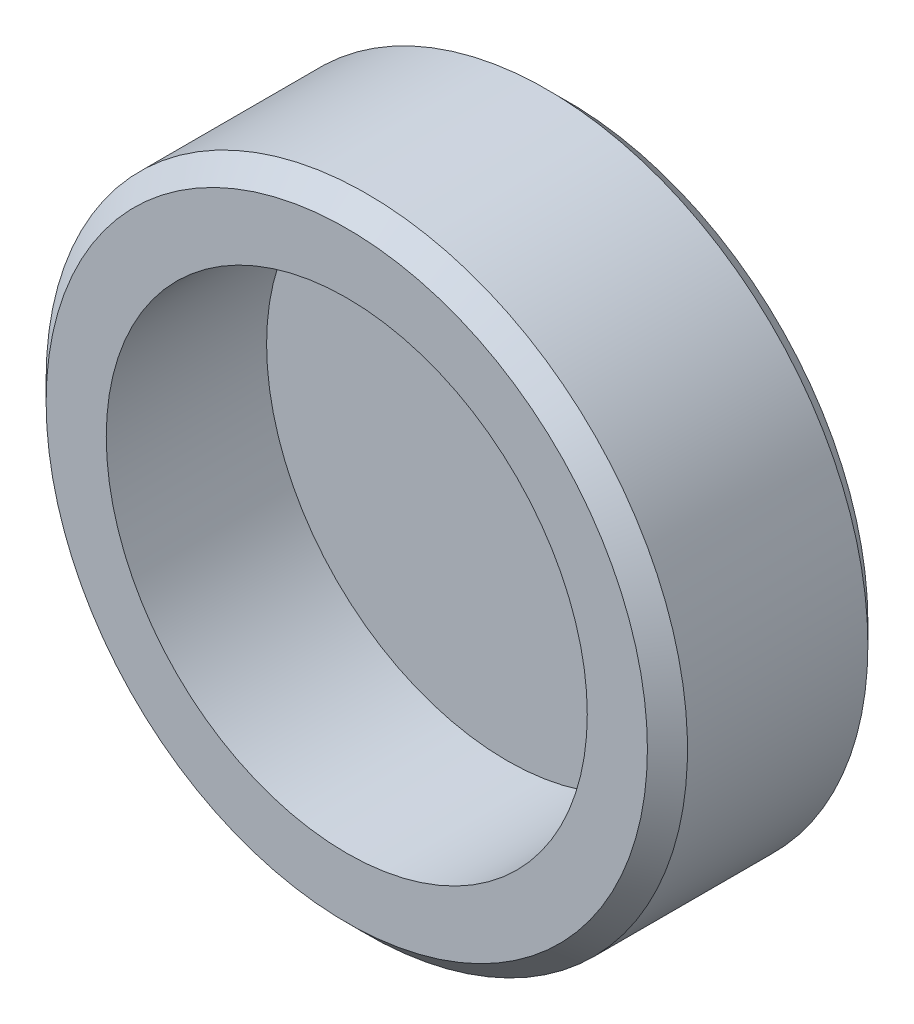
ISO-10303-21;
HEADER;
FILE_DESCRIPTION(('STEP AP214'),'2;1');
FILE_NAME('part.step','',(''),(''),'','','');
FILE_SCHEMA(('AUTOMOTIVE_DESIGN { 1 0 10303 214 1 1 1 1 }'));
ENDSEC;
DATA;
#1=APPLICATION_CONTEXT('core data for automotive mechanical design processes');
#2=APPLICATION_PROTOCOL_DEFINITION('international standard','automotive_design',2000,#1);
#3=PRODUCT_CONTEXT('',#1,'mechanical');
#4=PRODUCT('Part','Part','',(#3));
#5=PRODUCT_RELATED_PRODUCT_CATEGORY('part','',(#4));
#6=PRODUCT_DEFINITION_FORMATION('','',#4);
#7=PRODUCT_DEFINITION_CONTEXT('part definition',#1,'design');
#8=PRODUCT_DEFINITION('design','',#6,#7);
#9=PRODUCT_DEFINITION_SHAPE('','',#8);
#10=(LENGTH_UNIT() NAMED_UNIT(*) SI_UNIT(.MILLI.,.METRE.));
#11=(NAMED_UNIT(*) PLANE_ANGLE_UNIT() SI_UNIT($,.RADIAN.));
#12=(NAMED_UNIT(*) SI_UNIT($,.STERADIAN.) SOLID_ANGLE_UNIT());
#13=UNCERTAINTY_MEASURE_WITH_UNIT(LENGTH_MEASURE(1.E-05),#10,'distance_accuracy_value','');
#14=(GEOMETRIC_REPRESENTATION_CONTEXT(3) GLOBAL_UNCERTAINTY_ASSIGNED_CONTEXT((#13)) GLOBAL_UNIT_ASSIGNED_CONTEXT((#10,
#11,#12)) REPRESENTATION_CONTEXT('',''));
#15=CARTESIAN_POINT('',(0.,0.,0.));
#16=DIRECTION('',(0.,0.,1.));
#17=DIRECTION('',(1.,0.,0.));
#18=AXIS2_PLACEMENT_3D('',#15,#16,#17);
#19=CARTESIAN_POINT('',(0.,0.,11.));
#20=DIRECTION('',(0.,0.,-1.));
#21=DIRECTION('',(-1.,0.,0.));
#22=AXIS2_PLACEMENT_3D('',#19,#20,#21);
#23=CYLINDRICAL_SURFACE('',#22,16.);
#24=CARTESIAN_POINT('',(0.,0.,1.));
#25=DIRECTION('',(0.,0.,1.));
#26=DIRECTION('',(1.,0.,0.));
#27=AXIS2_PLACEMENT_3D('',#24,#25,#26);
#28=CIRCLE('',#27,16.);
#29=CARTESIAN_POINT('',(-16.,0.,0.999999999999999));
#30=VERTEX_POINT('',#29);
#31=EDGE_CURVE('E40',#30,#30,#28,.T.);
#32=CARTESIAN_POINT('',(0.,0.,9.99999999999998));
#33=DIRECTION('',(0.,0.,1.));
#34=DIRECTION('',(1.,0.,0.));
#35=AXIS2_PLACEMENT_3D('',#32,#33,#34);
#36=CIRCLE('',#35,16.);
#37=CARTESIAN_POINT('',(-16.,0.,9.99999999999998));
#38=VERTEX_POINT('',#37);
#39=EDGE_CURVE('E44',#38,#38,#36,.F.);
#40=CARTESIAN_POINT('',(-16.,0.,0.999999999999999));
#41=CARTESIAN_POINT('',(-16.,0.,1.09375));
#42=CARTESIAN_POINT('',(-16.,0.,1.1875));
#43=CARTESIAN_POINT('',(-16.,0.,1.375));
#44=CARTESIAN_POINT('',(-16.,0.,1.46875));
#45=CARTESIAN_POINT('',(-16.,0.,1.65625));
#46=CARTESIAN_POINT('',(-16.,0.,1.75));
#47=CARTESIAN_POINT('',(-16.,0.,1.9375));
#48=CARTESIAN_POINT('',(-16.,0.,2.03125));
#49=CARTESIAN_POINT('',(-16.,0.,2.21875));
#50=CARTESIAN_POINT('',(-16.,0.,2.3125));
#51=CARTESIAN_POINT('',(-16.,0.,2.5));
#52=CARTESIAN_POINT('',(-16.,0.,2.59375));
#53=CARTESIAN_POINT('',(-16.,0.,2.78125));
#54=CARTESIAN_POINT('',(-16.,0.,2.875));
#55=CARTESIAN_POINT('',(-16.,0.,3.0625));
#56=CARTESIAN_POINT('',(-16.,0.,3.15624999999999));
#57=CARTESIAN_POINT('',(-16.,0.,3.34374999999999));
#58=CARTESIAN_POINT('',(-16.,0.,3.43749999999999));
#59=CARTESIAN_POINT('',(-16.,0.,3.62499999999999));
#60=CARTESIAN_POINT('',(-16.,0.,3.71874999999999));
#61=CARTESIAN_POINT('',(-16.,0.,3.90624999999999));
#62=CARTESIAN_POINT('',(-16.,0.,3.99999999999999));
#63=CARTESIAN_POINT('',(-16.,0.,4.18749999999999));
#64=CARTESIAN_POINT('',(-16.,0.,4.28124999999999));
#65=CARTESIAN_POINT('',(-16.,0.,4.46874999999999));
#66=CARTESIAN_POINT('',(-16.,0.,4.56249999999999));
#67=CARTESIAN_POINT('',(-16.,0.,4.74999999999999));
#68=CARTESIAN_POINT('',(-16.,0.,4.84374999999999));
#69=CARTESIAN_POINT('',(-16.,0.,5.03124999999999));
#70=CARTESIAN_POINT('',(-16.,0.,5.12499999999999));
#71=CARTESIAN_POINT('',(-16.,0.,5.31249999999999));
#72=CARTESIAN_POINT('',(-16.,0.,5.40624999999999));
#73=CARTESIAN_POINT('',(-16.,0.,5.59374999999999));
#74=CARTESIAN_POINT('',(-16.,0.,5.68749999999999));
#75=CARTESIAN_POINT('',(-16.,0.,5.87499999999999));
#76=CARTESIAN_POINT('',(-16.,0.,5.96874999999999));
#77=CARTESIAN_POINT('',(-16.,0.,6.15624999999999));
#78=CARTESIAN_POINT('',(-16.,0.,6.24999999999999));
#79=CARTESIAN_POINT('',(-16.,0.,6.43749999999999));
#80=CARTESIAN_POINT('',(-16.,0.,6.53124999999999));
#81=CARTESIAN_POINT('',(-16.,0.,6.71874999999999));
#82=CARTESIAN_POINT('',(-16.,0.,6.81249999999999));
#83=CARTESIAN_POINT('',(-16.,0.,6.99999999999999));
#84=CARTESIAN_POINT('',(-16.,0.,7.09374999999999));
#85=CARTESIAN_POINT('',(-16.,0.,7.28124999999999));
#86=CARTESIAN_POINT('',(-16.,0.,7.37499999999999));
#87=CARTESIAN_POINT('',(-16.,0.,7.56249999999999));
#88=CARTESIAN_POINT('',(-16.,0.,7.65624999999999));
#89=CARTESIAN_POINT('',(-16.,0.,7.84374999999999));
#90=CARTESIAN_POINT('',(-16.,0.,7.93749999999999));
#91=CARTESIAN_POINT('',(-16.,0.,8.12499999999999));
#92=CARTESIAN_POINT('',(-16.,0.,8.21874999999999));
#93=CARTESIAN_POINT('',(-16.,0.,8.40624999999999));
#94=CARTESIAN_POINT('',(-16.,0.,8.49999999999999));
#95=CARTESIAN_POINT('',(-16.,0.,8.68749999999999));
#96=CARTESIAN_POINT('',(-16.,0.,8.78124999999998));
#97=CARTESIAN_POINT('',(-16.,0.,8.96874999999998));
#98=CARTESIAN_POINT('',(-16.,0.,9.06249999999998));
#99=CARTESIAN_POINT('',(-16.,0.,9.24999999999998));
#100=CARTESIAN_POINT('',(-16.,0.,9.34374999999998));
#101=CARTESIAN_POINT('',(-16.,0.,9.53124999999998));
#102=CARTESIAN_POINT('',(-16.,0.,9.62499999999998));
#103=CARTESIAN_POINT('',(-16.,0.,9.81249999999998));
#104=CARTESIAN_POINT('',(-16.,0.,9.90624999999998));
#105=CARTESIAN_POINT('',(-16.,0.,9.99999999999998));
#106=B_SPLINE_CURVE_WITH_KNOTS('',3,(#40,#41,#42,#43,#44,#45,#46,#47,#48,#49,#50,#51,#52,#53,
#54,#55,#56,#57,#58,#59,#60,#61,#62,#63,#64,#65,#66,#67,#68,#69,#70,#71,#72,#73,#74,#75,#76,#77,
#78,#79,#80,#81,#82,#83,#84,#85,#86,#87,#88,#89,#90,#91,#92,#93,#94,#95,#96,#97,#98,#99,#100,
#101,#102,#103,#104,#105),.UNSPECIFIED.,.F.,.F.,(4,2,2,2,2,2,2,2,2,2,2,2,2,2,2,2,2,2,2,2,2,2,2,
2,2,2,2,2,2,2,2,2,4),(0.,0.281249999999999,0.562499999999997,0.843749999999997,1.125,1.40625,
1.6875,1.96875,2.25,2.53125,2.81249999999999,3.09374999999999,3.37499999999999,3.65624999999999,
3.93749999999999,4.21874999999999,4.49999999999999,4.78124999999999,5.06249999999999,
5.34374999999999,5.62499999999999,5.90624999999999,6.18749999999999,6.46874999999999,
6.74999999999999,7.03124999999999,7.31249999999999,7.59374999999999,7.87499999999998,
8.15624999999998,8.43749999999999,8.71874999999998,8.99999999999998),.UNSPECIFIED.);
#107=EDGE_CURVE('BSEAM30',#30,#38,#106,.T.);
#108=ORIENTED_EDGE('',*,*,#31,.T.);
#109=ORIENTED_EDGE('',*,*,#39,.T.);
#110=ORIENTED_EDGE('',*,*,#107,.T.);
#111=ORIENTED_EDGE('',*,*,#107,.F.);
#112=EDGE_LOOP('',(#108,#110,#109,#111));
#113=FACE_BOUND('',#112,.T.);
#114=ADVANCED_FACE('F30',(#113),#23,.T.);
#115=CARTESIAN_POINT('',(0.,0.,11.));
#116=DIRECTION('',(0.,0.,1.));
#117=DIRECTION('',(1.,0.,0.));
#118=AXIS2_PLACEMENT_3D('',#115,#116,#117);
#119=PLANE('',#118);
#120=CARTESIAN_POINT('',(0.,0.,11.));
#121=DIRECTION('',(0.,0.,1.));
#122=DIRECTION('',(1.,0.,0.));
#123=AXIS2_PLACEMENT_3D('',#120,#121,#122);
#124=CIRCLE('',#123,12.);
#125=CARTESIAN_POINT('',(12.,0.,11.));
#126=VERTEX_POINT('',#125);
#127=EDGE_CURVE('E52',#126,#126,#124,.T.);
#128=ORIENTED_EDGE('',*,*,#127,.F.);
#129=EDGE_LOOP('',(#128));
#130=FACE_BOUND('',#129,.T.);
#131=CARTESIAN_POINT('',(0.,0.,11.));
#132=DIRECTION('',(0.,0.,1.));
#133=DIRECTION('',(1.,0.,0.));
#134=AXIS2_PLACEMENT_3D('',#131,#132,#133);
#135=CIRCLE('',#134,15.);
#136=CARTESIAN_POINT('',(-15.,0.,11.));
#137=VERTEX_POINT('',#136);
#138=EDGE_CURVE('E10',#137,#137,#135,.T.);
#139=ORIENTED_EDGE('',*,*,#138,.T.);
#140=EDGE_LOOP('',(#139));
#141=FACE_BOUND('',#140,.T.);
#142=ADVANCED_FACE('F58',(#130,#141),#119,.T.);
#143=CARTESIAN_POINT('',(0.,0.,0.));
#144=DIRECTION('',(0.,0.,1.));
#145=DIRECTION('',(1.,0.,0.));
#146=AXIS2_PLACEMENT_3D('',#143,#144,#145);
#147=PLANE('',#146);
#148=CARTESIAN_POINT('',(0.,0.,0.));
#149=DIRECTION('',(0.,0.,1.));
#150=DIRECTION('',(1.,0.,0.));
#151=AXIS2_PLACEMENT_3D('',#148,#149,#150);
#152=CIRCLE('',#151,15.);
#153=CARTESIAN_POINT('',(15.,0.,0.));
#154=VERTEX_POINT('',#153);
#155=EDGE_CURVE('E36',#154,#154,#152,.F.);
#156=ORIENTED_EDGE('',*,*,#155,.T.);
#157=EDGE_LOOP('',(#156));
#158=FACE_BOUND('',#157,.T.);
#159=ADVANCED_FACE('F60',(#158),#147,.F.);
#160=CARTESIAN_POINT('',(0.,0.,1.));
#161=DIRECTION('',(0.,0.,1.));
#162=DIRECTION('',(1.,0.,0.));
#163=AXIS2_PLACEMENT_3D('',#160,#161,#162);
#164=CONICAL_SURFACE('',#163,16.,0.785398163397448);
#165=ORIENTED_EDGE('',*,*,#155,.F.);
#166=EDGE_LOOP('',(#165));
#167=FACE_BOUND('',#166,.T.);
#168=ORIENTED_EDGE('',*,*,#31,.F.);
#169=EDGE_LOOP('',(#168));
#170=FACE_BOUND('',#169,.T.);
#171=ADVANCED_FACE('F65',(#167,#170),#164,.T.);
#172=CARTESIAN_POINT('',(0.,0.,11.));
#173=DIRECTION('',(0.,0.,-1.));
#174=DIRECTION('',(-1.,0.,0.));
#175=AXIS2_PLACEMENT_3D('',#172,#173,#174);
#176=CONICAL_SURFACE('',#175,15.,0.785398163397447);
#177=CARTESIAN_POINT('',(-16.,0.,9.99999999999998));
#178=CARTESIAN_POINT('',(-15.9895833333333,0.,10.0104166666667));
#179=CARTESIAN_POINT('',(-15.9791666666667,0.,10.0208333333333));
#180=CARTESIAN_POINT('',(-15.9583333333333,0.,10.0416666666667));
#181=CARTESIAN_POINT('',(-15.9479166666667,0.,10.0520833333333));
#182=CARTESIAN_POINT('',(-15.9270833333333,0.,10.0729166666667));
#183=CARTESIAN_POINT('',(-15.9166666666667,0.,10.0833333333333));
#184=CARTESIAN_POINT('',(-15.8958333333333,0.,10.1041666666667));
#185=CARTESIAN_POINT('',(-15.8854166666667,0.,10.1145833333333));
#186=CARTESIAN_POINT('',(-15.8645833333333,0.,10.1354166666667));
#187=CARTESIAN_POINT('',(-15.8541666666667,0.,10.1458333333333));
#188=CARTESIAN_POINT('',(-15.8333333333333,0.,10.1666666666667));
#189=CARTESIAN_POINT('',(-15.8229166666667,0.,10.1770833333333));
#190=CARTESIAN_POINT('',(-15.8020833333333,0.,10.1979166666667));
#191=CARTESIAN_POINT('',(-15.7916666666667,0.,10.2083333333333));
#192=CARTESIAN_POINT('',(-15.7708333333333,0.,10.2291666666667));
#193=CARTESIAN_POINT('',(-15.7604166666667,0.,10.2395833333333));
#194=CARTESIAN_POINT('',(-15.7395833333333,0.,10.2604166666667));
#195=CARTESIAN_POINT('',(-15.7291666666667,0.,10.2708333333333));
#196=CARTESIAN_POINT('',(-15.7083333333333,0.,10.2916666666667));
#197=CARTESIAN_POINT('',(-15.6979166666667,0.,10.3020833333333));
#198=CARTESIAN_POINT('',(-15.6770833333333,0.,10.3229166666667));
#199=CARTESIAN_POINT('',(-15.6666666666667,0.,10.3333333333333));
#200=CARTESIAN_POINT('',(-15.6458333333333,0.,10.3541666666667));
#201=CARTESIAN_POINT('',(-15.6354166666667,0.,10.3645833333333));
#202=CARTESIAN_POINT('',(-15.6145833333333,0.,10.3854166666667));
#203=CARTESIAN_POINT('',(-15.6041666666667,0.,10.3958333333333));
#204=CARTESIAN_POINT('',(-15.5833333333333,0.,10.4166666666667));
#205=CARTESIAN_POINT('',(-15.5729166666667,0.,10.4270833333333));
#206=CARTESIAN_POINT('',(-15.5520833333333,0.,10.4479166666667));
#207=CARTESIAN_POINT('',(-15.5416666666667,0.,10.4583333333333));
#208=CARTESIAN_POINT('',(-15.5208333333333,0.,10.4791666666667));
#209=CARTESIAN_POINT('',(-15.5104166666667,0.,10.4895833333333));
#210=CARTESIAN_POINT('',(-15.4895833333333,0.,10.5104166666667));
#211=CARTESIAN_POINT('',(-15.4791666666667,0.,10.5208333333333));
#212=CARTESIAN_POINT('',(-15.4583333333333,0.,10.5416666666667));
#213=CARTESIAN_POINT('',(-15.4479166666667,0.,10.5520833333333));
#214=CARTESIAN_POINT('',(-15.4270833333333,0.,10.5729166666667));
#215=CARTESIAN_POINT('',(-15.4166666666667,0.,10.5833333333333));
#216=CARTESIAN_POINT('',(-15.3958333333333,0.,10.6041666666667));
#217=CARTESIAN_POINT('',(-15.3854166666667,0.,10.6145833333333));
#218=CARTESIAN_POINT('',(-15.3645833333333,0.,10.6354166666667));
#219=CARTESIAN_POINT('',(-15.3541666666667,0.,10.6458333333333));
#220=CARTESIAN_POINT('',(-15.3333333333333,0.,10.6666666666667));
#221=CARTESIAN_POINT('',(-15.3229166666667,0.,10.6770833333333));
#222=CARTESIAN_POINT('',(-15.3020833333333,0.,10.6979166666667));
#223=CARTESIAN_POINT('',(-15.2916666666667,0.,10.7083333333333));
#224=CARTESIAN_POINT('',(-15.2708333333333,0.,10.7291666666667));
#225=CARTESIAN_POINT('',(-15.2604166666667,0.,10.7395833333333));
#226=CARTESIAN_POINT('',(-15.2395833333333,0.,10.7604166666667));
#227=CARTESIAN_POINT('',(-15.2291666666667,0.,10.7708333333333));
#228=CARTESIAN_POINT('',(-15.2083333333333,0.,10.7916666666667));
#229=CARTESIAN_POINT('',(-15.1979166666667,0.,10.8020833333333));
#230=CARTESIAN_POINT('',(-15.1770833333333,0.,10.8229166666667));
#231=CARTESIAN_POINT('',(-15.1666666666667,0.,10.8333333333333));
#232=CARTESIAN_POINT('',(-15.1458333333333,0.,10.8541666666667));
#233=CARTESIAN_POINT('',(-15.1354166666667,0.,10.8645833333333));
#234=CARTESIAN_POINT('',(-15.1145833333333,0.,10.8854166666667));
#235=CARTESIAN_POINT('',(-15.1041666666667,0.,10.8958333333333));
#236=CARTESIAN_POINT('',(-15.0833333333333,0.,10.9166666666667));
#237=CARTESIAN_POINT('',(-15.0729166666667,0.,10.9270833333333));
#238=CARTESIAN_POINT('',(-15.0520833333333,0.,10.9479166666667));
#239=CARTESIAN_POINT('',(-15.0416666666667,0.,10.9583333333333));
#240=CARTESIAN_POINT('',(-15.0208333333333,0.,10.9791666666667));
#241=CARTESIAN_POINT('',(-15.0104166666666,0.,10.9895833333333));
#242=CARTESIAN_POINT('',(-15.,0.,11.));
#243=B_SPLINE_CURVE_WITH_KNOTS('',3,(#177,#178,#179,#180,#181,#182,#183,#184,#185,#186,#187,
#188,#189,#190,#191,#192,#193,#194,#195,#196,#197,#198,#199,#200,#201,#202,#203,#204,#205,#206,
#207,#208,#209,#210,#211,#212,#213,#214,#215,#216,#217,#218,#219,#220,#221,#222,#223,#224,#225,
#226,#227,#228,#229,#230,#231,#232,#233,#234,#235,#236,#237,#238,#239,#240,#241,#242),
.UNSPECIFIED.,.F.,.F.,(4,2,2,2,2,2,2,2,2,2,2,2,2,2,2,2,2,2,2,2,2,2,2,2,2,2,2,2,2,2,2,2,4),(0.,
0.0441941738241617,0.0883883476483185,0.13258252147248,0.176776695296637,0.2209708691208,
0.265165042944957,0.309359216769118,0.353553390593277,0.397747564417438,0.4419417382416,
0.486135912065757,0.530330085889918,0.574524259714078,0.618718433538237,0.662912607362396,
0.707106781186557,0.751300955010717,0.795495128834876,0.839689302659036,0.883883476483195,
0.928077650307356,0.972271824131516,1.01646599795568,1.06066017177984,1.10485434560399,
1.14904851942815,1.19324269325231,1.23743686707648,1.28163104090063,1.32582521472479,
1.37001938854895,1.41421356237311),.UNSPECIFIED.);
#244=EDGE_CURVE('BSEAM71',#38,#137,#243,.T.);
#245=ORIENTED_EDGE('',*,*,#39,.F.);
#246=ORIENTED_EDGE('',*,*,#138,.F.);
#247=ORIENTED_EDGE('',*,*,#244,.T.);
#248=ORIENTED_EDGE('',*,*,#244,.F.);
#249=EDGE_LOOP('',(#245,#247,#246,#248));
#250=FACE_BOUND('',#249,.T.);
#251=ADVANCED_FACE('F71',(#250),#176,.T.);
#252=CARTESIAN_POINT('',(0.,0.,3.));
#253=DIRECTION('',(0.,0.,1.));
#254=DIRECTION('',(1.,0.,0.));
#255=AXIS2_PLACEMENT_3D('',#252,#253,#254);
#256=CYLINDRICAL_SURFACE('',#255,12.);
#257=CARTESIAN_POINT('',(0.,0.,3.));
#258=DIRECTION('',(0.,0.,1.));
#259=DIRECTION('',(1.,0.,0.));
#260=AXIS2_PLACEMENT_3D('',#257,#258,#259);
#261=CIRCLE('',#260,12.);
#262=CARTESIAN_POINT('',(12.,0.,3.));
#263=VERTEX_POINT('',#262);
#264=EDGE_CURVE('E49',#263,#263,#261,.T.);
#265=CARTESIAN_POINT('',(12.,0.,3.));
#266=CARTESIAN_POINT('',(12.,0.,3.08333333333333));
#267=CARTESIAN_POINT('',(12.,0.,3.16666666666666));
#268=CARTESIAN_POINT('',(12.,0.,3.33333333333333));
#269=CARTESIAN_POINT('',(12.,0.,3.41666666666666));
#270=CARTESIAN_POINT('',(12.,0.,3.58333333333333));
#271=CARTESIAN_POINT('',(12.,0.,3.66666666666666));
#272=CARTESIAN_POINT('',(12.,0.,3.83333333333333));
#273=CARTESIAN_POINT('',(12.,0.,3.91666666666666));
#274=CARTESIAN_POINT('',(12.,0.,4.08333333333333));
#275=CARTESIAN_POINT('',(12.,0.,4.16666666666666));
#276=CARTESIAN_POINT('',(12.,0.,4.33333333333333));
#277=CARTESIAN_POINT('',(12.,0.,4.41666666666666));
#278=CARTESIAN_POINT('',(12.,0.,4.58333333333333));
#279=CARTESIAN_POINT('',(12.,0.,4.66666666666666));
#280=CARTESIAN_POINT('',(12.,0.,4.83333333333333));
#281=CARTESIAN_POINT('',(12.,0.,4.91666666666666));
#282=CARTESIAN_POINT('',(12.,0.,5.08333333333333));
#283=CARTESIAN_POINT('',(12.,0.,5.16666666666666));
#284=CARTESIAN_POINT('',(12.,0.,5.33333333333333));
#285=CARTESIAN_POINT('',(12.,0.,5.41666666666666));
#286=CARTESIAN_POINT('',(12.,0.,5.58333333333333));
#287=CARTESIAN_POINT('',(12.,0.,5.66666666666666));
#288=CARTESIAN_POINT('',(12.,0.,5.83333333333333));
#289=CARTESIAN_POINT('',(12.,0.,5.91666666666666));
#290=CARTESIAN_POINT('',(12.,0.,6.08333333333333));
#291=CARTESIAN_POINT('',(12.,0.,6.16666666666666));
#292=CARTESIAN_POINT('',(12.,0.,6.33333333333333));
#293=CARTESIAN_POINT('',(12.,0.,6.41666666666666));
#294=CARTESIAN_POINT('',(12.,0.,6.58333333333333));
#295=CARTESIAN_POINT('',(12.,0.,6.66666666666666));
#296=CARTESIAN_POINT('',(12.,0.,6.83333333333333));
#297=CARTESIAN_POINT('',(12.,0.,6.91666666666666));
#298=CARTESIAN_POINT('',(12.,0.,7.08333333333333));
#299=CARTESIAN_POINT('',(12.,0.,7.16666666666666));
#300=CARTESIAN_POINT('',(12.,0.,7.33333333333333));
#301=CARTESIAN_POINT('',(12.,0.,7.41666666666666));
#302=CARTESIAN_POINT('',(12.,0.,7.58333333333333));
#303=CARTESIAN_POINT('',(12.,0.,7.66666666666666));
#304=CARTESIAN_POINT('',(12.,0.,7.83333333333333));
#305=CARTESIAN_POINT('',(12.,0.,7.91666666666666));
#306=CARTESIAN_POINT('',(12.,0.,8.08333333333333));
#307=CARTESIAN_POINT('',(12.,0.,8.16666666666666));
#308=CARTESIAN_POINT('',(12.,0.,8.33333333333333));
#309=CARTESIAN_POINT('',(12.,0.,8.41666666666666));
#310=CARTESIAN_POINT('',(12.,0.,8.58333333333333));
#311=CARTESIAN_POINT('',(12.,0.,8.66666666666666));
#312=CARTESIAN_POINT('',(12.,0.,8.83333333333333));
#313=CARTESIAN_POINT('',(12.,0.,8.91666666666666));
#314=CARTESIAN_POINT('',(12.,0.,9.08333333333333));
#315=CARTESIAN_POINT('',(12.,0.,9.16666666666666));
#316=CARTESIAN_POINT('',(12.,0.,9.33333333333333));
#317=CARTESIAN_POINT('',(12.,0.,9.41666666666667));
#318=CARTESIAN_POINT('',(12.,0.,9.58333333333333));
#319=CARTESIAN_POINT('',(12.,0.,9.66666666666667));
#320=CARTESIAN_POINT('',(12.,0.,9.83333333333333));
#321=CARTESIAN_POINT('',(12.,0.,9.91666666666667));
#322=CARTESIAN_POINT('',(12.,0.,10.0833333333333));
#323=CARTESIAN_POINT('',(12.,0.,10.1666666666667));
#324=CARTESIAN_POINT('',(12.,0.,10.3333333333333));
#325=CARTESIAN_POINT('',(12.,0.,10.4166666666667));
#326=CARTESIAN_POINT('',(12.,0.,10.5833333333333));
#327=CARTESIAN_POINT('',(12.,0.,10.6666666666667));
#328=CARTESIAN_POINT('',(12.,0.,10.8333333333333));
#329=CARTESIAN_POINT('',(12.,0.,10.9166666666667));
#330=CARTESIAN_POINT('',(12.,0.,11.));
#331=B_SPLINE_CURVE_WITH_KNOTS('',3,(#265,#266,#267,#268,#269,#270,#271,#272,#273,#274,#275,
#276,#277,#278,#279,#280,#281,#282,#283,#284,#285,#286,#287,#288,#289,#290,#291,#292,#293,#294,
#295,#296,#297,#298,#299,#300,#301,#302,#303,#304,#305,#306,#307,#308,#309,#310,#311,#312,#313,
#314,#315,#316,#317,#318,#319,#320,#321,#322,#323,#324,#325,#326,#327,#328,#329,#330),
.UNSPECIFIED.,.F.,.F.,(4,2,2,2,2,2,2,2,2,2,2,2,2,2,2,2,2,2,2,2,2,2,2,2,2,2,2,2,2,2,2,2,4),(0.,
0.25,0.5,0.75,1.,1.25,1.5,1.75,2.,2.25,2.5,2.75,3.,3.25,3.5,3.75,4.,4.25,4.5,4.75,5.,5.25,5.5,
5.75,6.,6.25,6.5,6.75,7.,7.25,7.5,7.75,8.),.UNSPECIFIED.);
#332=EDGE_CURVE('BSEAM56',#263,#126,#331,.T.);
#333=ORIENTED_EDGE('',*,*,#264,.F.);
#334=ORIENTED_EDGE('',*,*,#127,.T.);
#335=ORIENTED_EDGE('',*,*,#332,.T.);
#336=ORIENTED_EDGE('',*,*,#332,.F.);
#337=EDGE_LOOP('',(#333,#335,#334,#336));
#338=FACE_BOUND('',#337,.T.);
#339=ADVANCED_FACE('F56',(#338),#256,.F.);
#340=CARTESIAN_POINT('',(0.,0.,3.));
#341=DIRECTION('',(0.,0.,1.));
#342=DIRECTION('',(1.,0.,0.));
#343=AXIS2_PLACEMENT_3D('',#340,#341,#342);
#344=PLANE('',#343);
#345=ORIENTED_EDGE('',*,*,#264,.T.);
#346=EDGE_LOOP('',(#345));
#347=FACE_BOUND('',#346,.T.);
#348=ADVANCED_FACE('F78',(#347),#344,.T.);
#349=CLOSED_SHELL('',(#114,#142,#159,#171,#251,#339,#348));
#350=MANIFOLD_SOLID_BREP('B2',#349);
#351=ADVANCED_BREP_SHAPE_REPRESENTATION('',(#18,#350),#14);
#352=SHAPE_DEFINITION_REPRESENTATION(#9,#351);
ENDSEC;
END-ISO-10303-21;
